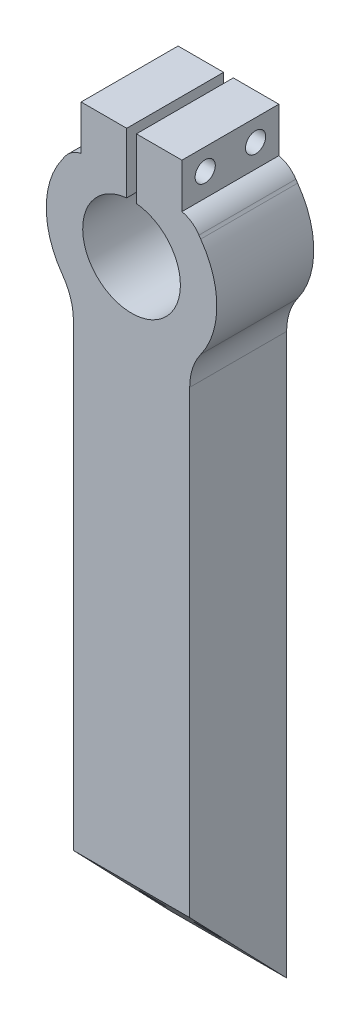
ISO-10303-21;
HEADER;
FILE_DESCRIPTION(('STEP AP214'),'2;1');
FILE_NAME('part.step','',(''),(''),'','','');
FILE_SCHEMA(('AUTOMOTIVE_DESIGN { 1 0 10303 214 1 1 1 1 }'));
ENDSEC;
DATA;
#1=APPLICATION_CONTEXT('core data for automotive mechanical design processes');
#2=APPLICATION_PROTOCOL_DEFINITION('international standard','automotive_design',2000,#1);
#3=PRODUCT_CONTEXT('',#1,'mechanical');
#4=PRODUCT('Part','Part','',(#3));
#5=PRODUCT_RELATED_PRODUCT_CATEGORY('part','',(#4));
#6=PRODUCT_DEFINITION_FORMATION('','',#4);
#7=PRODUCT_DEFINITION_CONTEXT('part definition',#1,'design');
#8=PRODUCT_DEFINITION('design','',#6,#7);
#9=PRODUCT_DEFINITION_SHAPE('','',#8);
#10=(LENGTH_UNIT() NAMED_UNIT(*) SI_UNIT(.MILLI.,.METRE.));
#11=(NAMED_UNIT(*) PLANE_ANGLE_UNIT() SI_UNIT($,.RADIAN.));
#12=(NAMED_UNIT(*) SI_UNIT($,.STERADIAN.) SOLID_ANGLE_UNIT());
#13=UNCERTAINTY_MEASURE_WITH_UNIT(LENGTH_MEASURE(1.E-05),#10,'distance_accuracy_value','');
#14=(GEOMETRIC_REPRESENTATION_CONTEXT(3) GLOBAL_UNCERTAINTY_ASSIGNED_CONTEXT((#13)) GLOBAL_UNIT_ASSIGNED_CONTEXT((#10,
#11,#12)) REPRESENTATION_CONTEXT('',''));
#15=CARTESIAN_POINT('',(0.,0.,0.));
#16=DIRECTION('',(0.,0.,1.));
#17=DIRECTION('',(1.,0.,0.));
#18=AXIS2_PLACEMENT_3D('',#15,#16,#17);
#19=CARTESIAN_POINT('',(15.,166.093476939431,25.));
#20=DIRECTION('',(0.,0.,-1.));
#21=DIRECTION('',(-1.,0.,0.));
#22=AXIS2_PLACEMENT_3D('',#19,#20,#21);
#23=PLANE('',#22);
#24=CARTESIAN_POINT('',(45.,187.749884767139,25.));
#25=DIRECTION('',(0.,0.,-1.));
#26=DIRECTION('',(-1.,0.,0.));
#27=AXIS2_PLACEMENT_3D('',#24,#25,#26);
#28=CIRCLE('',#27,15.);
#29=CARTESIAN_POINT('',(32.8378378378378,178.970259972122,25.));
#30=VERTEX_POINT('',#29);
#31=CARTESIAN_POINT('',(32.3835271270563,179.636647913313,25.));
#32=VERTEX_POINT('',#31);
#33=EDGE_CURVE('E312',#30,#32,#28,.T.);
#34=ORIENTED_EDGE('',*,*,#33,.T.);
#35=CARTESIAN_POINT('',(26.4958397863492,175.850470714861,25.));
#36=DIRECTION('',(0.,0.,-1.));
#37=DIRECTION('',(-1.,0.,0.));
#38=AXIS2_PLACEMENT_3D('',#35,#36,#37);
#39=CIRCLE('',#38,7.);
#40=CARTESIAN_POINT('',(28.,182.686953878862,25.));
#41=VERTEX_POINT('',#40);
#42=EDGE_CURVE('E52',#32,#41,#39,.F.);
#43=ORIENTED_EDGE('',*,*,#42,.T.);
#44=DIRECTION('',(0.,-1.,0.));
#45=VECTOR('',#44,1.);
#46=CARTESIAN_POINT('',(28.,199.186953878862,25.));
#47=LINE('',#46,#45);
#48=CARTESIAN_POINT('',(28.,194.186953878862,25.));
#49=VERTEX_POINT('',#48);
#50=EDGE_CURVE('E358',#49,#41,#47,.T.);
#51=ORIENTED_EDGE('',*,*,#50,.F.);
#52=DIRECTION('',(-1.,0.,0.));
#53=VECTOR('',#52,1.);
#54=CARTESIAN_POINT('',(0.,194.186953878862,25.));
#55=LINE('',#54,#53);
#56=CARTESIAN_POINT('',(16.25,194.186953878862,25.));
#57=VERTEX_POINT('',#56);
#58=EDGE_CURVE('E199',#49,#57,#55,.T.);
#59=ORIENTED_EDGE('',*,*,#58,.T.);
#60=DIRECTION('',(0.,1.,0.));
#61=VECTOR('',#60,1.);
#62=CARTESIAN_POINT('',(16.25,194.186953878862,25.));
#63=LINE('',#62,#61);
#64=CARTESIAN_POINT('',(16.25,178.631319656581,25.));
#65=VERTEX_POINT('',#64);
#66=EDGE_CURVE('E183',#65,#57,#63,.T.);
#67=ORIENTED_EDGE('',*,*,#66,.F.);
#68=CARTESIAN_POINT('',(15.,166.093476939431,25.));
#69=DIRECTION('',(0.,0.,1.));
#70=DIRECTION('',(1.,0.,0.));
#71=AXIS2_PLACEMENT_3D('',#68,#69,#70);
#72=CIRCLE('',#71,12.6);
#73=CARTESIAN_POINT('',(13.75,178.631319656581,25.));
#74=VERTEX_POINT('',#73);
#75=EDGE_CURVE('E190',#74,#65,#72,.T.);
#76=ORIENTED_EDGE('',*,*,#75,.F.);
#77=DIRECTION('',(0.,-1.,0.));
#78=VECTOR('',#77,1.);
#79=CARTESIAN_POINT('',(13.75,194.186953878862,25.));
#80=LINE('',#79,#78);
#81=CARTESIAN_POINT('',(13.75,194.186953878862,25.));
#82=VERTEX_POINT('',#81);
#83=EDGE_CURVE('E174',#82,#74,#80,.T.);
#84=ORIENTED_EDGE('',*,*,#83,.F.);
#85=CARTESIAN_POINT('',(2.,194.186953878862,25.));
#86=VERTEX_POINT('',#85);
#87=EDGE_CURVE('E186',#82,#86,#55,.T.);
#88=ORIENTED_EDGE('',*,*,#87,.T.);
#89=DIRECTION('',(0.,-1.,0.));
#90=VECTOR('',#89,1.);
#91=CARTESIAN_POINT('',(2.,199.186953878862,25.));
#92=LINE('',#91,#90);
#93=CARTESIAN_POINT('',(2.,182.686953878862,25.));
#94=VERTEX_POINT('',#93);
#95=EDGE_CURVE('E388',#86,#94,#92,.T.);
#96=ORIENTED_EDGE('',*,*,#95,.T.);
#97=CARTESIAN_POINT('',(3.50416021365078,175.850470714861,25.));
#98=DIRECTION('',(0.,0.,-1.));
#99=DIRECTION('',(-1.,0.,0.));
#100=AXIS2_PLACEMENT_3D('',#97,#98,#99);
#101=CIRCLE('',#100,7.);
#102=CARTESIAN_POINT('',(-2.38352712705629,179.636647913313,25.));
#103=VERTEX_POINT('',#102);
#104=EDGE_CURVE('E59',#94,#103,#101,.F.);
#105=ORIENTED_EDGE('',*,*,#104,.T.);
#106=CARTESIAN_POINT('',(-15.,187.749884767139,25.));
#107=DIRECTION('',(0.,0.,-1.));
#108=DIRECTION('',(-1.,0.,0.));
#109=AXIS2_PLACEMENT_3D('',#106,#107,#108);
#110=CIRCLE('',#109,15.);
#111=CARTESIAN_POINT('',(-2.83783783783784,178.970259972122,25.));
#112=VERTEX_POINT('',#111);
#113=EDGE_CURVE('E319',#103,#112,#110,.T.);
#114=ORIENTED_EDGE('',*,*,#113,.T.);
#115=CARTESIAN_POINT('',(15.,166.093476939431,25.));
#116=DIRECTION('',(0.,0.,1.));
#117=DIRECTION('',(-1.,0.,0.));
#118=AXIS2_PLACEMENT_3D('',#115,#116,#117);
#119=CIRCLE('',#118,22.);
#120=CARTESIAN_POINT('',(-2.83783783783784,153.21669390674,25.));
#121=VERTEX_POINT('',#120);
#122=EDGE_CURVE('E264',#112,#121,#119,.T.);
#123=ORIENTED_EDGE('',*,*,#122,.T.);
#124=CARTESIAN_POINT('',(-15.,144.437069111723,25.));
#125=DIRECTION('',(0.,0.,-1.));
#126=DIRECTION('',(-1.,0.,0.));
#127=AXIS2_PLACEMENT_3D('',#124,#125,#126);
#128=CIRCLE('',#127,15.);
#129=CARTESIAN_POINT('',(0.,144.437069111723,25.));
#130=VERTEX_POINT('',#129);
#131=EDGE_CURVE('E325',#121,#130,#128,.T.);
#132=ORIENTED_EDGE('',*,*,#131,.T.);
#133=DIRECTION('',(0.,-1.,0.));
#134=VECTOR('',#133,1.);
#135=CARTESIAN_POINT('',(0.,150.,25.));
#136=LINE('',#135,#134);
#137=CARTESIAN_POINT('',(0.,26.,25.));
#138=VERTEX_POINT('',#137);
#139=EDGE_CURVE('E256',#130,#138,#136,.T.);
#140=ORIENTED_EDGE('',*,*,#139,.T.);
#141=DIRECTION('',(-1.,0.,0.));
#142=VECTOR('',#141,1.);
#143=CARTESIAN_POINT('',(37.,26.,25.));
#144=LINE('',#143,#142);
#145=CARTESIAN_POINT('',(30.,26.,25.));
#146=VERTEX_POINT('',#145);
#147=EDGE_CURVE('E248',#146,#138,#144,.T.);
#148=ORIENTED_EDGE('',*,*,#147,.F.);
#149=DIRECTION('',(0.,1.,0.));
#150=VECTOR('',#149,1.);
#151=CARTESIAN_POINT('',(30.,0.,25.));
#152=LINE('',#151,#150);
#153=CARTESIAN_POINT('',(30.,144.437069111723,25.));
#154=VERTEX_POINT('',#153);
#155=EDGE_CURVE('E259',#146,#154,#152,.T.);
#156=ORIENTED_EDGE('',*,*,#155,.T.);
#157=CARTESIAN_POINT('',(45.,144.437069111723,25.));
#158=DIRECTION('',(0.,0.,-1.));
#159=DIRECTION('',(-1.,0.,0.));
#160=AXIS2_PLACEMENT_3D('',#157,#158,#159);
#161=CIRCLE('',#160,15.);
#162=CARTESIAN_POINT('',(32.8378378378378,153.21669390674,25.));
#163=VERTEX_POINT('',#162);
#164=EDGE_CURVE('E331',#154,#163,#161,.T.);
#165=ORIENTED_EDGE('',*,*,#164,.T.);
#166=EDGE_CURVE('E268',#163,#30,#119,.T.);
#167=ORIENTED_EDGE('',*,*,#166,.T.);
#168=EDGE_LOOP('',(#34,#43,#51,#59,#67,#76,#84,#88,#96,#105,#114,#123,#132,#140,#148,#156,#165,#167));
#169=FACE_BOUND('',#168,.T.);
#170=ADVANCED_FACE('F43',(#169),#23,.F.);
#171=CARTESIAN_POINT('',(15.,166.093476939431,0.));
#172=DIRECTION('',(0.,0.,-1.));
#173=DIRECTION('',(-1.,0.,0.));
#174=AXIS2_PLACEMENT_3D('',#171,#172,#173);
#175=PLANE('',#174);
#176=CARTESIAN_POINT('',(8.,13.,0.));
#177=DIRECTION('',(0.,0.,1.));
#178=DIRECTION('',(1.,0.,0.));
#179=AXIS2_PLACEMENT_3D('',#176,#177,#178);
#180=CIRCLE('',#179,6.25);
#181=CARTESIAN_POINT('',(14.25,13.,0.));
#182=VERTEX_POINT('',#181);
#183=EDGE_CURVE('E234',#182,#182,#180,.T.);
#184=ORIENTED_EDGE('',*,*,#183,.T.);
#185=EDGE_LOOP('',(#184));
#186=FACE_BOUND('',#185,.T.);
#187=CARTESIAN_POINT('',(22.,13.,0.));
#188=DIRECTION('',(0.,0.,1.));
#189=DIRECTION('',(1.,0.,0.));
#190=AXIS2_PLACEMENT_3D('',#187,#188,#189);
#191=CIRCLE('',#190,6.25);
#192=CARTESIAN_POINT('',(28.25,13.,0.));
#193=VERTEX_POINT('',#192);
#194=EDGE_CURVE('E238',#193,#193,#191,.T.);
#195=ORIENTED_EDGE('',*,*,#194,.T.);
#196=EDGE_LOOP('',(#195));
#197=FACE_BOUND('',#196,.T.);
#198=DIRECTION('',(0.,1.,0.));
#199=VECTOR('',#198,1.);
#200=CARTESIAN_POINT('',(28.,199.186953878862,0.));
#201=LINE('',#200,#199);
#202=CARTESIAN_POINT('',(28.,182.686953878862,0.));
#203=VERTEX_POINT('',#202);
#204=CARTESIAN_POINT('',(28.,194.186953878862,0.));
#205=VERTEX_POINT('',#204);
#206=EDGE_CURVE('E369',#203,#205,#201,.T.);
#207=ORIENTED_EDGE('',*,*,#206,.F.);
#208=CARTESIAN_POINT('',(26.4958397863492,175.850470714861,0.));
#209=DIRECTION('',(0.,0.,-1.));
#210=DIRECTION('',(-1.,0.,0.));
#211=AXIS2_PLACEMENT_3D('',#208,#209,#210);
#212=CIRCLE('',#211,7.);
#213=CARTESIAN_POINT('',(32.3835271270563,179.636647913313,0.));
#214=VERTEX_POINT('',#213);
#215=EDGE_CURVE('E348',#203,#214,#212,.T.);
#216=ORIENTED_EDGE('',*,*,#215,.T.);
#217=CARTESIAN_POINT('',(45.,187.749884767139,0.));
#218=DIRECTION('',(0.,0.,-1.));
#219=DIRECTION('',(-1.,0.,0.));
#220=AXIS2_PLACEMENT_3D('',#217,#218,#219);
#221=CIRCLE('',#220,15.);
#222=CARTESIAN_POINT('',(32.8378378378378,178.970259972122,0.));
#223=VERTEX_POINT('',#222);
#224=EDGE_CURVE('E309',#214,#223,#221,.F.);
#225=ORIENTED_EDGE('',*,*,#224,.T.);
#226=CARTESIAN_POINT('',(15.,166.093476939431,0.));
#227=DIRECTION('',(0.,0.,1.));
#228=DIRECTION('',(-1.,0.,0.));
#229=AXIS2_PLACEMENT_3D('',#226,#227,#228);
#230=CIRCLE('',#229,22.);
#231=CARTESIAN_POINT('',(32.8378378378378,153.21669390674,0.));
#232=VERTEX_POINT('',#231);
#233=EDGE_CURVE('E260',#232,#223,#230,.T.);
#234=ORIENTED_EDGE('',*,*,#233,.F.);
#235=CARTESIAN_POINT('',(45.,144.437069111723,0.));
#236=DIRECTION('',(0.,0.,-1.));
#237=DIRECTION('',(-1.,0.,0.));
#238=AXIS2_PLACEMENT_3D('',#235,#236,#237);
#239=CIRCLE('',#238,15.);
#240=CARTESIAN_POINT('',(30.,144.437069111723,0.));
#241=VERTEX_POINT('',#240);
#242=EDGE_CURVE('E328',#232,#241,#239,.F.);
#243=ORIENTED_EDGE('',*,*,#242,.T.);
#244=DIRECTION('',(0.,1.,0.));
#245=VECTOR('',#244,1.);
#246=CARTESIAN_POINT('',(30.,0.,0.));
#247=LINE('',#246,#245);
#248=CARTESIAN_POINT('',(30.,0.,0.));
#249=VERTEX_POINT('',#248);
#250=EDGE_CURVE('E274',#249,#241,#247,.T.);
#251=ORIENTED_EDGE('',*,*,#250,.F.);
#252=DIRECTION('',(1.,0.,0.));
#253=VECTOR('',#252,1.);
#254=CARTESIAN_POINT('',(0.,0.,0.));
#255=LINE('',#254,#253);
#256=CARTESIAN_POINT('',(0.,0.,0.));
#257=VERTEX_POINT('',#256);
#258=EDGE_CURVE('E271',#257,#249,#255,.T.);
#259=ORIENTED_EDGE('',*,*,#258,.F.);
#260=DIRECTION('',(0.,-1.,0.));
#261=VECTOR('',#260,1.);
#262=CARTESIAN_POINT('',(0.,150.,0.));
#263=LINE('',#262,#261);
#264=CARTESIAN_POINT('',(0.,144.437069111723,0.));
#265=VERTEX_POINT('',#264);
#266=EDGE_CURVE('E255',#265,#257,#263,.T.);
#267=ORIENTED_EDGE('',*,*,#266,.F.);
#268=CARTESIAN_POINT('',(-15.,144.437069111723,0.));
#269=DIRECTION('',(0.,0.,-1.));
#270=DIRECTION('',(-1.,0.,0.));
#271=AXIS2_PLACEMENT_3D('',#268,#269,#270);
#272=CIRCLE('',#271,15.);
#273=CARTESIAN_POINT('',(-2.83783783783784,153.21669390674,0.));
#274=VERTEX_POINT('',#273);
#275=EDGE_CURVE('E322',#265,#274,#272,.F.);
#276=ORIENTED_EDGE('',*,*,#275,.T.);
#277=CARTESIAN_POINT('',(-2.83783783783784,178.970259972122,0.));
#278=VERTEX_POINT('',#277);
#279=EDGE_CURVE('E278',#278,#274,#230,.T.);
#280=ORIENTED_EDGE('',*,*,#279,.F.);
#281=CARTESIAN_POINT('',(-15.,187.749884767139,0.));
#282=DIRECTION('',(0.,0.,-1.));
#283=DIRECTION('',(-1.,0.,0.));
#284=AXIS2_PLACEMENT_3D('',#281,#282,#283);
#285=CIRCLE('',#284,15.);
#286=CARTESIAN_POINT('',(-2.38352712705629,179.636647913313,0.));
#287=VERTEX_POINT('',#286);
#288=EDGE_CURVE('E315',#278,#287,#285,.F.);
#289=ORIENTED_EDGE('',*,*,#288,.T.);
#290=CARTESIAN_POINT('',(3.50416021365078,175.850470714861,0.));
#291=DIRECTION('',(0.,0.,-1.));
#292=DIRECTION('',(-1.,0.,0.));
#293=AXIS2_PLACEMENT_3D('',#290,#291,#292);
#294=CIRCLE('',#293,7.);
#295=CARTESIAN_POINT('',(2.,182.686953878862,0.));
#296=VERTEX_POINT('',#295);
#297=EDGE_CURVE('E340',#287,#296,#294,.T.);
#298=ORIENTED_EDGE('',*,*,#297,.T.);
#299=DIRECTION('',(0.,1.,0.));
#300=VECTOR('',#299,1.);
#301=CARTESIAN_POINT('',(2.,199.186953878862,0.));
#302=LINE('',#301,#300);
#303=CARTESIAN_POINT('',(2.,194.186953878862,0.));
#304=VERTEX_POINT('',#303);
#305=EDGE_CURVE('E384',#296,#304,#302,.T.);
#306=ORIENTED_EDGE('',*,*,#305,.T.);
#307=DIRECTION('',(-1.,0.,0.));
#308=VECTOR('',#307,1.);
#309=CARTESIAN_POINT('',(0.,194.186953878862,0.));
#310=LINE('',#309,#308);
#311=CARTESIAN_POINT('',(13.75,194.186953878862,0.));
#312=VERTEX_POINT('',#311);
#313=EDGE_CURVE('E207',#312,#304,#310,.T.);
#314=ORIENTED_EDGE('',*,*,#313,.F.);
#315=DIRECTION('',(0.,-1.,0.));
#316=VECTOR('',#315,1.);
#317=CARTESIAN_POINT('',(13.75,194.186953878862,0.));
#318=LINE('',#317,#316);
#319=CARTESIAN_POINT('',(13.75,178.631319656581,0.));
#320=VERTEX_POINT('',#319);
#321=EDGE_CURVE('E177',#312,#320,#318,.T.);
#322=ORIENTED_EDGE('',*,*,#321,.T.);
#323=CARTESIAN_POINT('',(15.,166.093476939431,0.));
#324=DIRECTION('',(0.,0.,1.));
#325=DIRECTION('',(1.,0.,0.));
#326=AXIS2_PLACEMENT_3D('',#323,#324,#325);
#327=CIRCLE('',#326,12.6);
#328=CARTESIAN_POINT('',(16.25,178.631319656581,0.));
#329=VERTEX_POINT('',#328);
#330=EDGE_CURVE('E205',#320,#329,#327,.T.);
#331=ORIENTED_EDGE('',*,*,#330,.T.);
#332=DIRECTION('',(0.,1.,0.));
#333=VECTOR('',#332,1.);
#334=CARTESIAN_POINT('',(16.25,194.186953878862,0.));
#335=LINE('',#334,#333);
#336=CARTESIAN_POINT('',(16.25,194.186953878862,0.));
#337=VERTEX_POINT('',#336);
#338=EDGE_CURVE('E192',#329,#337,#335,.T.);
#339=ORIENTED_EDGE('',*,*,#338,.T.);
#340=EDGE_CURVE('E200',#205,#337,#310,.T.);
#341=ORIENTED_EDGE('',*,*,#340,.F.);
#342=EDGE_LOOP('',(#207,#216,#225,#234,#243,#251,#259,#267,#276,#280,#289,#298,#306,#314,#322,
#331,#339,#341));
#343=FACE_BOUND('',#342,.T.);
#344=ADVANCED_FACE('F398',(#186,#197,#343),#175,.T.);
#345=CARTESIAN_POINT('',(37.,188.686953878862,19.));
#346=DIRECTION('',(-1.,0.,0.));
#347=DIRECTION('',(0.,0.,1.));
#348=AXIS2_PLACEMENT_3D('',#345,#346,#347);
#349=CYLINDRICAL_SURFACE('',#348,2.6);
#350=CARTESIAN_POINT('',(2.,188.686953878862,19.));
#351=DIRECTION('',(-1.,0.,0.));
#352=DIRECTION('',(0.,0.,1.));
#353=AXIS2_PLACEMENT_3D('',#350,#351,#352);
#354=CIRCLE('',#353,2.6);
#355=CARTESIAN_POINT('',(2.,188.686953878862,21.6));
#356=VERTEX_POINT('',#355);
#357=EDGE_CURVE('E210',#356,#356,#354,.T.);
#358=ORIENTED_EDGE('',*,*,#357,.T.);
#359=EDGE_LOOP('',(#358));
#360=FACE_BOUND('',#359,.T.);
#361=CARTESIAN_POINT('',(13.75,188.686953878862,19.));
#362=DIRECTION('',(1.,0.,0.));
#363=DIRECTION('',(0.,1.,0.));
#364=AXIS2_PLACEMENT_3D('',#361,#362,#363);
#365=CIRCLE('',#364,2.6);
#366=CARTESIAN_POINT('',(13.75,191.286953878862,19.));
#367=VERTEX_POINT('',#366);
#368=EDGE_CURVE('E816',#367,#367,#365,.T.);
#369=ORIENTED_EDGE('',*,*,#368,.T.);
#370=EDGE_LOOP('',(#369));
#371=FACE_BOUND('',#370,.T.);
#372=ADVANCED_FACE('F455',(#360,#371),#349,.F.);
#373=CARTESIAN_POINT('',(28.,188.686953878862,19.));
#374=DIRECTION('',(-1.,0.,0.));
#375=DIRECTION('',(0.,0.,1.));
#376=AXIS2_PLACEMENT_3D('',#373,#374,#375);
#377=CIRCLE('',#376,2.6);
#378=CARTESIAN_POINT('',(28.,188.686953878862,21.6));
#379=VERTEX_POINT('',#378);
#380=EDGE_CURVE('E377',#379,#379,#377,.T.);
#381=ORIENTED_EDGE('',*,*,#380,.F.);
#382=EDGE_LOOP('',(#381));
#383=FACE_BOUND('',#382,.T.);
#384=CARTESIAN_POINT('',(16.25,188.686953878862,19.));
#385=DIRECTION('',(-1.,0.,0.));
#386=DIRECTION('',(0.,-1.,0.));
#387=AXIS2_PLACEMENT_3D('',#384,#385,#386);
#388=CIRCLE('',#387,2.6);
#389=CARTESIAN_POINT('',(16.25,186.086953878862,19.));
#390=VERTEX_POINT('',#389);
#391=EDGE_CURVE('E806',#390,#390,#388,.T.);
#392=ORIENTED_EDGE('',*,*,#391,.T.);
#393=EDGE_LOOP('',(#392));
#394=FACE_BOUND('',#393,.T.);
#395=ADVANCED_FACE('F565',(#383,#394),#349,.F.);
#396=CARTESIAN_POINT('',(37.,188.686953878862,6.));
#397=DIRECTION('',(-1.,0.,0.));
#398=DIRECTION('',(0.,0.,1.));
#399=AXIS2_PLACEMENT_3D('',#396,#397,#398);
#400=CYLINDRICAL_SURFACE('',#399,2.59999999999999);
#401=CARTESIAN_POINT('',(2.,188.686953878862,6.));
#402=DIRECTION('',(-1.,0.,0.));
#403=DIRECTION('',(0.,0.,1.));
#404=AXIS2_PLACEMENT_3D('',#401,#402,#403);
#405=CIRCLE('',#404,2.59999999999999);
#406=CARTESIAN_POINT('',(2.,188.686953878862,8.59999999999998));
#407=VERTEX_POINT('',#406);
#408=EDGE_CURVE('E341',#407,#407,#405,.T.);
#409=ORIENTED_EDGE('',*,*,#408,.T.);
#410=EDGE_LOOP('',(#409));
#411=FACE_BOUND('',#410,.T.);
#412=CARTESIAN_POINT('',(13.75,188.686953878862,6.));
#413=DIRECTION('',(1.,0.,0.));
#414=DIRECTION('',(0.,1.,0.));
#415=AXIS2_PLACEMENT_3D('',#412,#413,#414);
#416=CIRCLE('',#415,2.59999999999999);
#417=CARTESIAN_POINT('',(13.75,191.286953878862,6.));
#418=VERTEX_POINT('',#417);
#419=EDGE_CURVE('E812',#418,#418,#416,.T.);
#420=ORIENTED_EDGE('',*,*,#419,.T.);
#421=EDGE_LOOP('',(#420));
#422=FACE_BOUND('',#421,.T.);
#423=ADVANCED_FACE('F575',(#411,#422),#400,.F.);
#424=CARTESIAN_POINT('',(28.,188.686953878862,6.));
#425=DIRECTION('',(-1.,0.,0.));
#426=DIRECTION('',(0.,0.,1.));
#427=AXIS2_PLACEMENT_3D('',#424,#425,#426);
#428=CIRCLE('',#427,2.59999999999999);
#429=CARTESIAN_POINT('',(28.,188.686953878862,8.59999999999998));
#430=VERTEX_POINT('',#429);
#431=EDGE_CURVE('E373',#430,#430,#428,.T.);
#432=ORIENTED_EDGE('',*,*,#431,.F.);
#433=EDGE_LOOP('',(#432));
#434=FACE_BOUND('',#433,.T.);
#435=CARTESIAN_POINT('',(16.25,188.686953878862,6.));
#436=DIRECTION('',(-1.,0.,0.));
#437=DIRECTION('',(0.,-1.,0.));
#438=AXIS2_PLACEMENT_3D('',#435,#436,#437);
#439=CIRCLE('',#438,2.59999999999999);
#440=CARTESIAN_POINT('',(16.25,186.086953878862,6.));
#441=VERTEX_POINT('',#440);
#442=EDGE_CURVE('E802',#441,#441,#439,.T.);
#443=ORIENTED_EDGE('',*,*,#442,.T.);
#444=EDGE_LOOP('',(#443));
#445=FACE_BOUND('',#444,.T.);
#446=ADVANCED_FACE('F584',(#434,#445),#400,.F.);
#447=CARTESIAN_POINT('',(15.,166.093476939431,25.));
#448=DIRECTION('',(0.,0.,-1.));
#449=DIRECTION('',(-1.,0.,0.));
#450=AXIS2_PLACEMENT_3D('',#447,#448,#449);
#451=CYLINDRICAL_SURFACE('',#450,12.6);
#452=ORIENTED_EDGE('',*,*,#330,.F.);
#453=DIRECTION('',(0.,0.,-1.));
#454=VECTOR('',#453,1.);
#455=CARTESIAN_POINT('',(13.75,178.631319656581,25.));
#456=LINE('',#455,#454);
#457=EDGE_CURVE('E788',#320,#74,#456,.F.);
#458=ORIENTED_EDGE('',*,*,#457,.T.);
#459=ORIENTED_EDGE('',*,*,#75,.T.);
#460=DIRECTION('',(0.,0.,-1.));
#461=VECTOR('',#460,1.);
#462=CARTESIAN_POINT('',(16.25,178.631319656581,25.));
#463=LINE('',#462,#461);
#464=EDGE_CURVE('E789',#65,#329,#463,.T.);
#465=ORIENTED_EDGE('',*,*,#464,.T.);
#466=EDGE_LOOP('',(#452,#458,#459,#465));
#467=FACE_BOUND('',#466,.T.);
#468=ADVANCED_FACE('F594',(#467),#451,.F.);
#469=CARTESIAN_POINT('',(0.,194.186953878862,25.));
#470=DIRECTION('',(0.,-1.,0.));
#471=DIRECTION('',(0.,0.,-1.));
#472=AXIS2_PLACEMENT_3D('',#469,#470,#471);
#473=PLANE('',#472);
#474=DIRECTION('',(0.,0.,-1.));
#475=VECTOR('',#474,1.);
#476=CARTESIAN_POINT('',(13.75,194.186953878862,25.));
#477=LINE('',#476,#475);
#478=EDGE_CURVE('E171',#82,#312,#477,.T.);
#479=ORIENTED_EDGE('',*,*,#478,.T.);
#480=ORIENTED_EDGE('',*,*,#313,.T.);
#481=DIRECTION('',(0.,0.,-1.));
#482=VECTOR('',#481,1.);
#483=CARTESIAN_POINT('',(2.,194.186953878862,25.));
#484=LINE('',#483,#482);
#485=EDGE_CURVE('E197',#304,#86,#484,.F.);
#486=ORIENTED_EDGE('',*,*,#485,.T.);
#487=ORIENTED_EDGE('',*,*,#87,.F.);
#488=EDGE_LOOP('',(#479,#480,#486,#487));
#489=FACE_BOUND('',#488,.T.);
#490=ADVANCED_FACE('F195',(#489),#473,.F.);
#491=DIRECTION('',(0.,0.,-1.));
#492=VECTOR('',#491,1.);
#493=CARTESIAN_POINT('',(16.25,194.186953878862,25.));
#494=LINE('',#493,#492);
#495=EDGE_CURVE('E182',#57,#337,#494,.T.);
#496=ORIENTED_EDGE('',*,*,#495,.F.);
#497=ORIENTED_EDGE('',*,*,#58,.F.);
#498=DIRECTION('',(0.,0.,-1.));
#499=VECTOR('',#498,1.);
#500=CARTESIAN_POINT('',(28.,194.186953878862,25.));
#501=LINE('',#500,#499);
#502=EDGE_CURVE('E336',#49,#205,#501,.T.);
#503=ORIENTED_EDGE('',*,*,#502,.T.);
#504=ORIENTED_EDGE('',*,*,#340,.T.);
#505=EDGE_LOOP('',(#496,#497,#503,#504));
#506=FACE_BOUND('',#505,.T.);
#507=ADVANCED_FACE('F440',(#506),#473,.F.);
#508=CARTESIAN_POINT('',(45.,187.749884767139,25.));
#509=DIRECTION('',(0.,0.,-1.));
#510=DIRECTION('',(-1.,0.,0.));
#511=AXIS2_PLACEMENT_3D('',#508,#509,#510);
#512=CYLINDRICAL_SURFACE('',#511,15.);
#513=ORIENTED_EDGE('',*,*,#224,.F.);
#514=DIRECTION('',(0.,0.,-1.));
#515=VECTOR('',#514,1.);
#516=CARTESIAN_POINT('',(32.3835271270563,179.636647913313,25.));
#517=LINE('',#516,#515);
#518=EDGE_CURVE('E67',#214,#32,#517,.F.);
#519=ORIENTED_EDGE('',*,*,#518,.T.);
#520=ORIENTED_EDGE('',*,*,#33,.F.);
#521=DIRECTION('',(0.,0.,-1.));
#522=VECTOR('',#521,1.);
#523=CARTESIAN_POINT('',(32.8378378378378,178.970259972122,25.));
#524=LINE('',#523,#522);
#525=EDGE_CURVE('E292',#223,#30,#524,.F.);
#526=ORIENTED_EDGE('',*,*,#525,.F.);
#527=EDGE_LOOP('',(#513,#519,#520,#526));
#528=FACE_BOUND('',#527,.T.);
#529=ADVANCED_FACE('F438',(#528),#512,.F.);
#530=CARTESIAN_POINT('',(-15.,187.749884767139,25.));
#531=DIRECTION('',(0.,0.,-1.));
#532=DIRECTION('',(-1.,0.,0.));
#533=AXIS2_PLACEMENT_3D('',#530,#531,#532);
#534=CYLINDRICAL_SURFACE('',#533,15.);
#535=ORIENTED_EDGE('',*,*,#113,.F.);
#536=DIRECTION('',(0.,0.,-1.));
#537=VECTOR('',#536,1.);
#538=CARTESIAN_POINT('',(-2.38352712705629,179.636647913313,25.));
#539=LINE('',#538,#537);
#540=EDGE_CURVE('E11',#103,#287,#539,.T.);
#541=ORIENTED_EDGE('',*,*,#540,.T.);
#542=ORIENTED_EDGE('',*,*,#288,.F.);
#543=DIRECTION('',(0.,0.,-1.));
#544=VECTOR('',#543,1.);
#545=CARTESIAN_POINT('',(-2.83783783783784,178.970259972122,25.));
#546=LINE('',#545,#544);
#547=EDGE_CURVE('E298',#112,#278,#546,.T.);
#548=ORIENTED_EDGE('',*,*,#547,.F.);
#549=EDGE_LOOP('',(#535,#541,#542,#548));
#550=FACE_BOUND('',#549,.T.);
#551=ADVANCED_FACE('F402',(#550),#534,.F.);
#552=CARTESIAN_POINT('',(15.,166.093476939431,25.));
#553=DIRECTION('',(0.,0.,-1.));
#554=DIRECTION('',(-1.,0.,0.));
#555=AXIS2_PLACEMENT_3D('',#552,#553,#554);
#556=CYLINDRICAL_SURFACE('',#555,22.);
#557=ORIENTED_EDGE('',*,*,#122,.F.);
#558=ORIENTED_EDGE('',*,*,#547,.T.);
#559=ORIENTED_EDGE('',*,*,#279,.T.);
#560=DIRECTION('',(0.,0.,-1.));
#561=VECTOR('',#560,1.);
#562=CARTESIAN_POINT('',(-2.83783783783784,153.21669390674,25.));
#563=LINE('',#562,#561);
#564=EDGE_CURVE('E295',#274,#121,#563,.F.);
#565=ORIENTED_EDGE('',*,*,#564,.T.);
#566=EDGE_LOOP('',(#557,#558,#559,#565));
#567=FACE_BOUND('',#566,.T.);
#568=ADVANCED_FACE('F405',(#567),#556,.T.);
#569=ORIENTED_EDGE('',*,*,#233,.T.);
#570=ORIENTED_EDGE('',*,*,#525,.T.);
#571=ORIENTED_EDGE('',*,*,#166,.F.);
#572=DIRECTION('',(0.,0.,-1.));
#573=VECTOR('',#572,1.);
#574=CARTESIAN_POINT('',(32.8378378378378,153.21669390674,25.));
#575=LINE('',#574,#573);
#576=EDGE_CURVE('E288',#163,#232,#575,.T.);
#577=ORIENTED_EDGE('',*,*,#576,.T.);
#578=EDGE_LOOP('',(#569,#570,#571,#577));
#579=FACE_BOUND('',#578,.T.);
#580=ADVANCED_FACE('F434',(#579),#556,.T.);
#581=CARTESIAN_POINT('',(0.,150.,25.));
#582=DIRECTION('',(1.,0.,0.));
#583=DIRECTION('',(0.,0.,-1.));
#584=AXIS2_PLACEMENT_3D('',#581,#582,#583);
#585=PLANE('',#584);
#586=ORIENTED_EDGE('',*,*,#139,.F.);
#587=DIRECTION('',(0.,0.,1.));
#588=VECTOR('',#587,1.);
#589=CARTESIAN_POINT('',(0.,144.437069111723,0.));
#590=LINE('',#589,#588);
#591=EDGE_CURVE('E302',#130,#265,#590,.F.);
#592=ORIENTED_EDGE('',*,*,#591,.T.);
#593=ORIENTED_EDGE('',*,*,#266,.T.);
#594=DIRECTION('',(0.,0.720833064901856,0.693108716251785));
#595=VECTOR('',#594,1.);
#596=CARTESIAN_POINT('',(0.,0.,0.));
#597=LINE('',#596,#595);
#598=EDGE_CURVE('E233',#257,#138,#597,.T.);
#599=ORIENTED_EDGE('',*,*,#598,.T.);
#600=EDGE_LOOP('',(#586,#592,#593,#599));
#601=FACE_BOUND('',#600,.T.);
#602=ADVANCED_FACE('F414',(#601),#585,.F.);
#603=CARTESIAN_POINT('',(30.,0.,25.));
#604=DIRECTION('',(-1.,0.,0.));
#605=DIRECTION('',(0.,0.,1.));
#606=AXIS2_PLACEMENT_3D('',#603,#604,#605);
#607=PLANE('',#606);
#608=ORIENTED_EDGE('',*,*,#250,.T.);
#609=DIRECTION('',(0.,0.,1.));
#610=VECTOR('',#609,1.);
#611=CARTESIAN_POINT('',(30.,144.437069111723,25.));
#612=LINE('',#611,#610);
#613=EDGE_CURVE('E306',#241,#154,#612,.T.);
#614=ORIENTED_EDGE('',*,*,#613,.T.);
#615=ORIENTED_EDGE('',*,*,#155,.F.);
#616=DIRECTION('',(0.,0.720833064901856,0.693108716251785));
#617=VECTOR('',#616,1.);
#618=CARTESIAN_POINT('',(30.,12.4903920061491,12.0099923136049));
#619=LINE('',#618,#617);
#620=EDGE_CURVE('E252',#249,#146,#619,.T.);
#621=ORIENTED_EDGE('',*,*,#620,.F.);
#622=EDGE_LOOP('',(#608,#614,#615,#621));
#623=FACE_BOUND('',#622,.T.);
#624=ADVANCED_FACE('F424',(#623),#607,.F.);
#625=CARTESIAN_POINT('',(37.,0.,0.));
#626=DIRECTION('',(0.,-0.693108716251785,0.720833064901856));
#627=DIRECTION('',(0.,-0.720833064901856,-0.693108716251785));
#628=AXIS2_PLACEMENT_3D('',#625,#626,#627);
#629=PLANE('',#628);
#630=CARTESIAN_POINT('',(8.,13.,12.5));
#631=DIRECTION('',(0.,-0.693108716251785,0.720833064901856));
#632=DIRECTION('',(0.,-0.720833064901856,-0.693108716251785));
#633=AXIS2_PLACEMENT_3D('',#630,#631,#632);
#634=ELLIPSE('',#633,3.53757357169401,2.55);
#635=CARTESIAN_POINT('',(8.,10.45,10.0480769230769));
#636=VERTEX_POINT('',#635);
#637=EDGE_CURVE('E219',#636,#636,#634,.F.);
#638=ORIENTED_EDGE('',*,*,#637,.T.);
#639=EDGE_LOOP('',(#638));
#640=FACE_BOUND('',#639,.T.);
#641=CARTESIAN_POINT('',(22.,13.,12.5));
#642=DIRECTION('',(0.,-0.693108716251785,0.720833064901856));
#643=DIRECTION('',(0.,-0.720833064901856,-0.693108716251785));
#644=AXIS2_PLACEMENT_3D('',#641,#642,#643);
#645=ELLIPSE('',#644,3.53757357169401,2.55);
#646=CARTESIAN_POINT('',(22.,10.45,10.0480769230769));
#647=VERTEX_POINT('',#646);
#648=EDGE_CURVE('E224',#647,#647,#645,.F.);
#649=ORIENTED_EDGE('',*,*,#648,.T.);
#650=EDGE_LOOP('',(#649));
#651=FACE_BOUND('',#650,.T.);
#652=ORIENTED_EDGE('',*,*,#620,.T.);
#653=ORIENTED_EDGE('',*,*,#147,.T.);
#654=ORIENTED_EDGE('',*,*,#598,.F.);
#655=ORIENTED_EDGE('',*,*,#258,.T.);
#656=EDGE_LOOP('',(#652,#653,#654,#655));
#657=FACE_BOUND('',#656,.T.);
#658=ADVANCED_FACE('F420',(#640,#651,#657),#629,.T.);
#659=CARTESIAN_POINT('',(22.,13.,3.5));
#660=DIRECTION('',(0.,0.,-1.));
#661=DIRECTION('',(-1.,0.,0.));
#662=AXIS2_PLACEMENT_3D('',#659,#660,#661);
#663=CYLINDRICAL_SURFACE('',#662,6.25);
#664=CARTESIAN_POINT('',(22.,13.,3.5));
#665=DIRECTION('',(0.,0.,1.));
#666=DIRECTION('',(1.,0.,0.));
#667=AXIS2_PLACEMENT_3D('',#664,#665,#666);
#668=CIRCLE('',#667,6.25);
#669=CARTESIAN_POINT('',(28.25,13.,3.5));
#670=VERTEX_POINT('',#669);
#671=EDGE_CURVE('E228',#670,#670,#668,.T.);
#672=ORIENTED_EDGE('',*,*,#671,.T.);
#673=EDGE_LOOP('',(#672));
#674=FACE_BOUND('',#673,.T.);
#675=ORIENTED_EDGE('',*,*,#194,.F.);
#676=EDGE_LOOP('',(#675));
#677=FACE_BOUND('',#676,.T.);
#678=ADVANCED_FACE('F695',(#674,#677),#663,.F.);
#679=CARTESIAN_POINT('',(22.,13.,3.5));
#680=DIRECTION('',(0.,0.,1.));
#681=DIRECTION('',(1.,0.,0.));
#682=AXIS2_PLACEMENT_3D('',#679,#680,#681);
#683=PLANE('',#682);
#684=CARTESIAN_POINT('',(22.,13.,3.5));
#685=DIRECTION('',(0.,0.,1.));
#686=DIRECTION('',(1.,0.,0.));
#687=AXIS2_PLACEMENT_3D('',#684,#685,#686);
#688=CIRCLE('',#687,2.55);
#689=CARTESIAN_POINT('',(24.55,13.,3.5));
#690=VERTEX_POINT('',#689);
#691=EDGE_CURVE('E223',#690,#690,#688,.F.);
#692=ORIENTED_EDGE('',*,*,#691,.F.);
#693=EDGE_LOOP('',(#692));
#694=FACE_BOUND('',#693,.T.);
#695=ORIENTED_EDGE('',*,*,#671,.F.);
#696=EDGE_LOOP('',(#695));
#697=FACE_BOUND('',#696,.T.);
#698=ADVANCED_FACE('F685',(#694,#697),#683,.F.);
#699=CARTESIAN_POINT('',(8.,13.,3.5));
#700=DIRECTION('',(0.,0.,-1.));
#701=DIRECTION('',(-1.,0.,0.));
#702=AXIS2_PLACEMENT_3D('',#699,#700,#701);
#703=CYLINDRICAL_SURFACE('',#702,6.25);
#704=CARTESIAN_POINT('',(8.,13.,3.5));
#705=DIRECTION('',(0.,0.,1.));
#706=DIRECTION('',(1.,0.,0.));
#707=AXIS2_PLACEMENT_3D('',#704,#705,#706);
#708=CIRCLE('',#707,6.25);
#709=CARTESIAN_POINT('',(14.25,13.,3.5));
#710=VERTEX_POINT('',#709);
#711=EDGE_CURVE('E229',#710,#710,#708,.T.);
#712=ORIENTED_EDGE('',*,*,#711,.T.);
#713=EDGE_LOOP('',(#712));
#714=FACE_BOUND('',#713,.T.);
#715=ORIENTED_EDGE('',*,*,#183,.F.);
#716=EDGE_LOOP('',(#715));
#717=FACE_BOUND('',#716,.T.);
#718=ADVANCED_FACE('F675',(#714,#717),#703,.F.);
#719=CARTESIAN_POINT('',(8.,13.,3.5));
#720=DIRECTION('',(0.,0.,1.));
#721=DIRECTION('',(1.,0.,0.));
#722=AXIS2_PLACEMENT_3D('',#719,#720,#721);
#723=PLANE('',#722);
#724=CARTESIAN_POINT('',(8.,13.,3.5));
#725=DIRECTION('',(0.,0.,1.));
#726=DIRECTION('',(1.,0.,0.));
#727=AXIS2_PLACEMENT_3D('',#724,#725,#726);
#728=CIRCLE('',#727,2.55);
#729=CARTESIAN_POINT('',(10.55,13.,3.5));
#730=VERTEX_POINT('',#729);
#731=EDGE_CURVE('E215',#730,#730,#728,.F.);
#732=ORIENTED_EDGE('',*,*,#731,.F.);
#733=EDGE_LOOP('',(#732));
#734=FACE_BOUND('',#733,.T.);
#735=ORIENTED_EDGE('',*,*,#711,.F.);
#736=EDGE_LOOP('',(#735));
#737=FACE_BOUND('',#736,.T.);
#738=ADVANCED_FACE('F665',(#734,#737),#723,.F.);
#739=CARTESIAN_POINT('',(8.,13.,25.));
#740=DIRECTION('',(0.,0.,-1.));
#741=DIRECTION('',(-1.,0.,0.));
#742=AXIS2_PLACEMENT_3D('',#739,#740,#741);
#743=CYLINDRICAL_SURFACE('',#742,2.55);
#744=ORIENTED_EDGE('',*,*,#637,.F.);
#745=EDGE_LOOP('',(#744));
#746=FACE_BOUND('',#745,.T.);
#747=ORIENTED_EDGE('',*,*,#731,.T.);
#748=EDGE_LOOP('',(#747));
#749=FACE_BOUND('',#748,.T.);
#750=ADVANCED_FACE('F656',(#746,#749),#743,.F.);
#751=CARTESIAN_POINT('',(22.,13.,25.));
#752=DIRECTION('',(0.,0.,-1.));
#753=DIRECTION('',(-1.,0.,0.));
#754=AXIS2_PLACEMENT_3D('',#751,#752,#753);
#755=CYLINDRICAL_SURFACE('',#754,2.55);
#756=ORIENTED_EDGE('',*,*,#648,.F.);
#757=EDGE_LOOP('',(#756));
#758=FACE_BOUND('',#757,.T.);
#759=ORIENTED_EDGE('',*,*,#691,.T.);
#760=EDGE_LOOP('',(#759));
#761=FACE_BOUND('',#760,.T.);
#762=ADVANCED_FACE('F638',(#758,#761),#755,.F.);
#763=CARTESIAN_POINT('',(-15.,144.437069111723,25.));
#764=DIRECTION('',(0.,0.,-1.));
#765=DIRECTION('',(-1.,0.,0.));
#766=AXIS2_PLACEMENT_3D('',#763,#764,#765);
#767=CYLINDRICAL_SURFACE('',#766,15.);
#768=ORIENTED_EDGE('',*,*,#131,.F.);
#769=ORIENTED_EDGE('',*,*,#564,.F.);
#770=ORIENTED_EDGE('',*,*,#275,.F.);
#771=ORIENTED_EDGE('',*,*,#591,.F.);
#772=EDGE_LOOP('',(#768,#769,#770,#771));
#773=FACE_BOUND('',#772,.T.);
#774=ADVANCED_FACE('F411',(#773),#767,.F.);
#775=CARTESIAN_POINT('',(45.,144.437069111723,25.));
#776=DIRECTION('',(0.,0.,-1.));
#777=DIRECTION('',(-1.,0.,0.));
#778=AXIS2_PLACEMENT_3D('',#775,#776,#777);
#779=CYLINDRICAL_SURFACE('',#778,15.);
#780=ORIENTED_EDGE('',*,*,#164,.F.);
#781=ORIENTED_EDGE('',*,*,#613,.F.);
#782=ORIENTED_EDGE('',*,*,#242,.F.);
#783=ORIENTED_EDGE('',*,*,#576,.F.);
#784=EDGE_LOOP('',(#780,#781,#782,#783));
#785=FACE_BOUND('',#784,.T.);
#786=ADVANCED_FACE('F430',(#785),#779,.F.);
#787=CARTESIAN_POINT('',(2.,0.,0.));
#788=DIRECTION('',(-1.,0.,0.));
#789=DIRECTION('',(0.,0.,1.));
#790=AXIS2_PLACEMENT_3D('',#787,#788,#789);
#791=PLANE('',#790);
#792=ORIENTED_EDGE('',*,*,#357,.F.);
#793=EDGE_LOOP('',(#792));
#794=FACE_BOUND('',#793,.T.);
#795=ORIENTED_EDGE('',*,*,#408,.F.);
#796=EDGE_LOOP('',(#795));
#797=FACE_BOUND('',#796,.T.);
#798=ORIENTED_EDGE('',*,*,#305,.F.);
#799=DIRECTION('',(0.,0.,-1.));
#800=VECTOR('',#799,1.);
#801=CARTESIAN_POINT('',(2.,182.686953878862,0.));
#802=LINE('',#801,#800);
#803=EDGE_CURVE('E345',#94,#296,#802,.T.);
#804=ORIENTED_EDGE('',*,*,#803,.F.);
#805=ORIENTED_EDGE('',*,*,#95,.F.);
#806=ORIENTED_EDGE('',*,*,#485,.F.);
#807=EDGE_LOOP('',(#798,#804,#805,#806));
#808=FACE_BOUND('',#807,.T.);
#809=ADVANCED_FACE('F396',(#794,#797,#808),#791,.T.);
#810=CARTESIAN_POINT('',(28.,0.,0.));
#811=DIRECTION('',(-1.,0.,0.));
#812=DIRECTION('',(0.,0.,1.));
#813=AXIS2_PLACEMENT_3D('',#810,#811,#812);
#814=PLANE('',#813);
#815=ORIENTED_EDGE('',*,*,#380,.T.);
#816=EDGE_LOOP('',(#815));
#817=FACE_BOUND('',#816,.T.);
#818=ORIENTED_EDGE('',*,*,#431,.T.);
#819=EDGE_LOOP('',(#818));
#820=FACE_BOUND('',#819,.T.);
#821=ORIENTED_EDGE('',*,*,#502,.F.);
#822=ORIENTED_EDGE('',*,*,#50,.T.);
#823=DIRECTION('',(0.,0.,-1.));
#824=VECTOR('',#823,1.);
#825=CARTESIAN_POINT('',(28.,182.686953878862,0.));
#826=LINE('',#825,#824);
#827=EDGE_CURVE('E366',#41,#203,#826,.T.);
#828=ORIENTED_EDGE('',*,*,#827,.T.);
#829=ORIENTED_EDGE('',*,*,#206,.T.);
#830=EDGE_LOOP('',(#821,#822,#828,#829));
#831=FACE_BOUND('',#830,.T.);
#832=ADVANCED_FACE('F365',(#817,#820,#831),#814,.F.);
#833=CARTESIAN_POINT('',(16.25,194.186953878862,25.));
#834=DIRECTION('',(-1.,0.,0.));
#835=DIRECTION('',(0.,-1.,0.));
#836=AXIS2_PLACEMENT_3D('',#833,#834,#835);
#837=PLANE('',#836);
#838=ORIENTED_EDGE('',*,*,#391,.F.);
#839=EDGE_LOOP('',(#838));
#840=FACE_BOUND('',#839,.T.);
#841=ORIENTED_EDGE('',*,*,#442,.F.);
#842=EDGE_LOOP('',(#841));
#843=FACE_BOUND('',#842,.T.);
#844=ORIENTED_EDGE('',*,*,#66,.T.);
#845=ORIENTED_EDGE('',*,*,#495,.T.);
#846=ORIENTED_EDGE('',*,*,#338,.F.);
#847=ORIENTED_EDGE('',*,*,#464,.F.);
#848=EDGE_LOOP('',(#844,#845,#846,#847));
#849=FACE_BOUND('',#848,.T.);
#850=ADVANCED_FACE('F505',(#840,#843,#849),#837,.T.);
#851=CARTESIAN_POINT('',(13.75,194.186953878862,25.));
#852=DIRECTION('',(1.,0.,0.));
#853=DIRECTION('',(0.,1.,0.));
#854=AXIS2_PLACEMENT_3D('',#851,#852,#853);
#855=PLANE('',#854);
#856=ORIENTED_EDGE('',*,*,#368,.F.);
#857=EDGE_LOOP('',(#856));
#858=FACE_BOUND('',#857,.T.);
#859=ORIENTED_EDGE('',*,*,#419,.F.);
#860=EDGE_LOOP('',(#859));
#861=FACE_BOUND('',#860,.T.);
#862=ORIENTED_EDGE('',*,*,#321,.F.);
#863=ORIENTED_EDGE('',*,*,#478,.F.);
#864=ORIENTED_EDGE('',*,*,#83,.T.);
#865=ORIENTED_EDGE('',*,*,#457,.F.);
#866=EDGE_LOOP('',(#862,#863,#864,#865));
#867=FACE_BOUND('',#866,.T.);
#868=ADVANCED_FACE('F173',(#858,#861,#867),#855,.T.);
#869=CARTESIAN_POINT('',(26.4958397863492,175.850470714861,25.));
#870=DIRECTION('',(0.,0.,-1.));
#871=DIRECTION('',(-1.,0.,0.));
#872=AXIS2_PLACEMENT_3D('',#869,#870,#871);
#873=CYLINDRICAL_SURFACE('',#872,7.);
#874=ORIENTED_EDGE('',*,*,#42,.F.);
#875=ORIENTED_EDGE('',*,*,#518,.F.);
#876=ORIENTED_EDGE('',*,*,#215,.F.);
#877=ORIENTED_EDGE('',*,*,#827,.F.);
#878=EDGE_LOOP('',(#874,#875,#876,#877));
#879=FACE_BOUND('',#878,.T.);
#880=ADVANCED_FACE('F371',(#879),#873,.T.);
#881=CARTESIAN_POINT('',(3.50416021365078,175.850470714861,0.));
#882=DIRECTION('',(0.,0.,-1.));
#883=DIRECTION('',(-1.,0.,0.));
#884=AXIS2_PLACEMENT_3D('',#881,#882,#883);
#885=CYLINDRICAL_SURFACE('',#884,7.);
#886=ORIENTED_EDGE('',*,*,#104,.F.);
#887=ORIENTED_EDGE('',*,*,#803,.T.);
#888=ORIENTED_EDGE('',*,*,#297,.F.);
#889=ORIENTED_EDGE('',*,*,#540,.F.);
#890=EDGE_LOOP('',(#886,#887,#888,#889));
#891=FACE_BOUND('',#890,.T.);
#892=ADVANCED_FACE('F45',(#891),#885,.T.);
#893=CLOSED_SHELL('',(#170,#344,#372,#395,#423,#446,#468,#490,#507,#529,#551,#568,#580,#602,
#624,#658,#678,#698,#718,#738,#750,#762,#774,#786,#809,#832,#850,#868,#880,#892));
#894=MANIFOLD_SOLID_BREP('B2',#893);
#895=ADVANCED_BREP_SHAPE_REPRESENTATION('',(#18,#894),#14);
#896=SHAPE_DEFINITION_REPRESENTATION(#9,#895);
ENDSEC;
END-ISO-10303-21;
